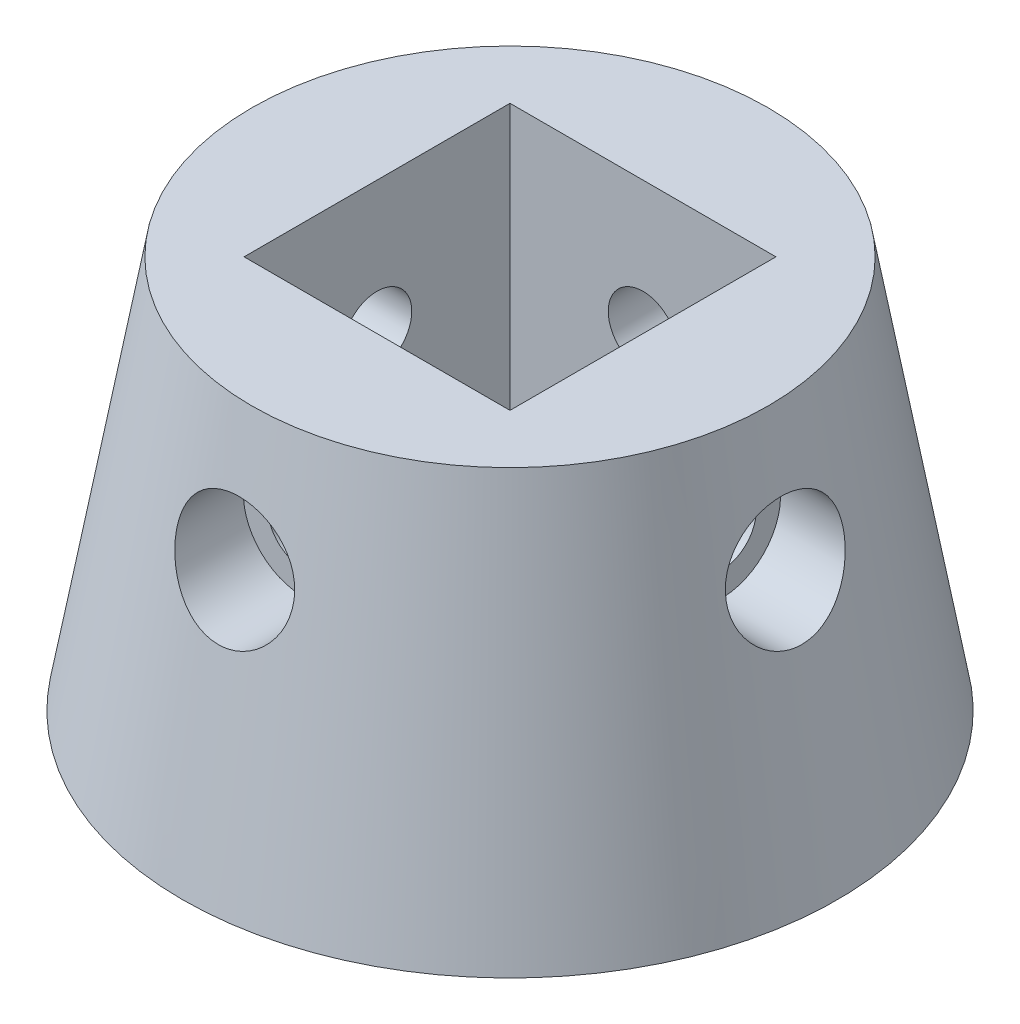
ISO-10303-21;
HEADER;
FILE_DESCRIPTION(('STEP AP214'),'2;1');
FILE_NAME('part.step','',(''),(''),'','','');
FILE_SCHEMA(('AUTOMOTIVE_DESIGN { 1 0 10303 214 1 1 1 1 }'));
ENDSEC;
DATA;
#1=APPLICATION_CONTEXT('core data for automotive mechanical design processes');
#2=APPLICATION_PROTOCOL_DEFINITION('international standard','automotive_design',2000,#1);
#3=PRODUCT_CONTEXT('',#1,'mechanical');
#4=PRODUCT('Part','Part','',(#3));
#5=PRODUCT_RELATED_PRODUCT_CATEGORY('part','',(#4));
#6=PRODUCT_DEFINITION_FORMATION('','',#4);
#7=PRODUCT_DEFINITION_CONTEXT('part definition',#1,'design');
#8=PRODUCT_DEFINITION('design','',#6,#7);
#9=PRODUCT_DEFINITION_SHAPE('','',#8);
#10=(LENGTH_UNIT() NAMED_UNIT(*) SI_UNIT(.MILLI.,.METRE.));
#11=(NAMED_UNIT(*) PLANE_ANGLE_UNIT() SI_UNIT($,.RADIAN.));
#12=(NAMED_UNIT(*) SI_UNIT($,.STERADIAN.) SOLID_ANGLE_UNIT());
#13=UNCERTAINTY_MEASURE_WITH_UNIT(LENGTH_MEASURE(1.E-05),#10,'distance_accuracy_value','');
#14=(GEOMETRIC_REPRESENTATION_CONTEXT(3) GLOBAL_UNCERTAINTY_ASSIGNED_CONTEXT((#13)) GLOBAL_UNIT_ASSIGNED_CONTEXT((#10,
#11,#12)) REPRESENTATION_CONTEXT('',''));
#15=CARTESIAN_POINT('',(0.,0.,0.));
#16=DIRECTION('',(0.,0.,1.));
#17=DIRECTION('',(1.,0.,0.));
#18=AXIS2_PLACEMENT_3D('',#15,#16,#17);
#19=CARTESIAN_POINT('',(0.,0.,0.));
#20=DIRECTION('',(0.,-1.,0.));
#21=DIRECTION('',(0.,0.,1.));
#22=AXIS2_PLACEMENT_3D('',#19,#20,#21);
#23=CONICAL_SURFACE('',#22,25.,0.174532925199433);
#24=CARTESIAN_POINT('',(-3.17924939476003,23.1847092937846,20.6688258492088));
#25=CARTESIAN_POINT('',(-3.00059448379588,23.3630397434884,20.6644896794293));
#26=CARTESIAN_POINT('',(-2.80677084879042,23.5264370171455,20.6628992762013));
#27=CARTESIAN_POINT('',(-2.3943624420111,23.8185076840616,20.6628964569913));
#28=CARTESIAN_POINT('',(-2.17575596313348,23.9471502971341,20.664486847649));
#29=CARTESIAN_POINT('',(-1.72017379836009,24.1659090108007,20.6686798525035));
#30=CARTESIAN_POINT('',(-1.48320722855043,24.2560440880279,20.6712819669091));
#31=CARTESIAN_POINT('',(-0.997562291741338,24.3953016215347,20.6758186026197));
#32=CARTESIAN_POINT('',(-0.748886203486125,24.4444320230146,20.677753253212));
#33=CARTESIAN_POINT('',(-0.246388998426274,24.5003668810089,20.6799842053389));
#34=CARTESIAN_POINT('',(0.00743997679781232,24.5071009123083,20.6802777807695));
#35=CARTESIAN_POINT('',(0.512629078209401,24.477860310658,20.6790822582704));
#36=CARTESIAN_POINT('',(0.763989119660604,24.4418842169821,20.6775930993695));
#37=CARTESIAN_POINT('',(1.25692288069639,24.3282876579257,20.6735562251311));
#38=CARTESIAN_POINT('',(1.49850319931375,24.2506957947592,20.6710092371028));
#39=CARTESIAN_POINT('',(1.96523370264023,24.0560801546741,20.6663400147529));
#40=CARTESIAN_POINT('',(2.19038348979655,23.9390554240233,20.6642177907067));
#41=CARTESIAN_POINT('',(2.61803215692439,23.6687786304909,20.6624439648929));
#42=CARTESIAN_POINT('',(2.82051384263947,23.5154993383775,20.6627942258329));
#43=CARTESIAN_POINT('',(3.19682888124425,23.1771523442005,20.6682995930261));
#44=CARTESIAN_POINT('',(3.37066375972014,22.9920863360117,20.6734544433136));
#45=CARTESIAN_POINT('',(3.68378537789302,22.596719390731,20.6907712707235));
#46=CARTESIAN_POINT('',(3.82326235522669,22.3865674335782,20.7028933650982));
#47=CARTESIAN_POINT('',(4.06499527422967,21.9464905597661,20.7358715893591));
#48=CARTESIAN_POINT('',(4.16725503902898,21.7165676770724,20.7567268216621));
#49=CARTESIAN_POINT('',(4.33107987681061,21.2462535529807,20.8078749161039));
#50=CARTESIAN_POINT('',(4.39303869442709,21.0059888287968,20.8380720750331));
#51=CARTESIAN_POINT('',(4.47666461546419,20.519908676123,20.9079268691845));
#52=CARTESIAN_POINT('',(4.49833015850463,20.2740930330436,20.9475848707161));
#53=CARTESIAN_POINT('',(4.50149813863872,19.7815456860653,21.0357275237627));
#54=CARTESIAN_POINT('',(4.48263819267845,19.5348255761311,21.0842882348035));
#55=CARTESIAN_POINT('',(4.40526520106138,19.0491330127787,21.1880672279834));
#56=CARTESIAN_POINT('',(4.34674439004499,18.810162086207,21.2432868121492));
#57=CARTESIAN_POINT('',(4.18932954593779,18.3375552494264,21.3598276566691));
#58=CARTESIAN_POINT('',(4.08908170859407,18.1044063958613,21.4212955918568));
#59=CARTESIAN_POINT('',(3.85106792700563,17.658374731201,21.5452567695456));
#60=CARTESIAN_POINT('',(3.71329326110753,17.4454966467998,21.6077502472173));
#61=CARTESIAN_POINT('',(3.39910258969567,17.0396255953365,21.7318677806788));
#62=CARTESIAN_POINT('',(3.22169391515468,16.8473756986293,21.7934158219225));
#63=CARTESIAN_POINT('',(2.834999979187,16.4955634579287,21.9096295618724));
#64=CARTESIAN_POINT('',(2.62571676719114,16.3359990139108,21.9642957026504));
#65=CARTESIAN_POINT('',(2.18491895047741,16.0575688415075,22.0618005211735));
#66=CARTESIAN_POINT('',(1.95390716437292,15.9379818614729,22.1048457564749));
#67=CARTESIAN_POINT('',(1.47287466478014,15.7399290760054,22.1770900763535));
#68=CARTESIAN_POINT('',(1.22286255171933,15.6614447910494,22.2062953827162));
#69=CARTESIAN_POINT('',(0.726631517957308,15.5522190646041,22.2471692677225));
#70=CARTESIAN_POINT('',(0.481041859030196,15.518959999244,22.2597613291924));
#71=CARTESIAN_POINT('',(-0.0125429709897271,15.4932422274715,22.269486182123));
#72=CARTESIAN_POINT('',(-0.260537492749591,15.5007727977558,22.2666230366477));
#73=CARTESIAN_POINT('',(-0.741543237699874,15.5551830330362,22.2460969119639));
#74=CARTESIAN_POINT('',(-0.974759486968966,15.6004976941979,22.2290226040751));
#75=CARTESIAN_POINT('',(-1.42997559376434,15.7267144499193,22.1820875386654));
#76=CARTESIAN_POINT('',(-1.65197476639247,15.8076187146072,22.1522260014273));
#77=CARTESIAN_POINT('',(-2.08293562555325,16.0039466443657,22.081135571466));
#78=CARTESIAN_POINT('',(-2.29160098656839,16.1199498995505,22.0397168047104));
#79=CARTESIAN_POINT('',(-2.68679452108829,16.3823452394143,21.9484309654771));
#80=CARTESIAN_POINT('',(-2.87331692185813,16.5287452213831,21.8985616981185));
#81=CARTESIAN_POINT('',(-3.23006835684602,16.8569622112505,21.7903742050016));
#82=CARTESIAN_POINT('',(-3.39879380711688,17.0403066377425,21.7317387502863));
#83=CARTESIAN_POINT('',(-3.70353074786168,17.4318560014476,21.6118462514121));
#84=CARTESIAN_POINT('',(-3.83953283380962,17.6400680598245,21.550588459551));
#85=CARTESIAN_POINT('',(-4.01914076827651,17.9718642575493,21.4580230978541));
#86=CARTESIAN_POINT('',(-4.07587322619095,18.0884355980823,21.4263687043237));
#87=CARTESIAN_POINT('',(-4.17912712884253,18.3261816951752,21.3637552831363));
#88=CARTESIAN_POINT('',(-4.22565215287156,18.4473548205538,21.3327960151592));
#89=CARTESIAN_POINT('',(-4.30814281769727,18.6935643116124,21.271997444554));
#90=CARTESIAN_POINT('',(-4.34410441261651,18.8186021372913,21.2421585748538));
#91=CARTESIAN_POINT('',(-4.40511309439848,19.0716127977618,21.1840259357653));
#92=CARTESIAN_POINT('',(-4.43016465094562,19.1995844079628,21.1557315377928));
#93=CARTESIAN_POINT('',(-4.46902265571744,19.4571116277664,21.1011430538228));
#94=CARTESIAN_POINT('',(-4.48287274768819,19.5866590738319,21.0748415697767));
#95=CARTESIAN_POINT('',(-4.49928042460086,19.8468390344228,21.0244316403668));
#96=CARTESIAN_POINT('',(-4.50184267254617,19.9774710785533,21.0003222934639));
#97=CARTESIAN_POINT('',(-4.49555519354621,20.2389351248404,20.9545192947697));
#98=CARTESIAN_POINT('',(-4.48670139216039,20.3697671817335,20.9328265084625));
#99=CARTESIAN_POINT('',(-4.45754020913605,20.630503872497,20.8920482318641));
#100=CARTESIAN_POINT('',(-4.43723778940656,20.7604088834724,20.8729616164891));
#101=CARTESIAN_POINT('',(-4.38621198285625,21.0135014682958,20.8381399070062));
#102=CARTESIAN_POINT('',(-4.35590364745784,21.1367593364967,20.8223066631473));
#103=CARTESIAN_POINT('',(-4.28489645736775,21.3804958255142,20.7931561879153));
#104=CARTESIAN_POINT('',(-4.24420183364132,21.5009755562961,20.7798379358681));
#105=CARTESIAN_POINT('',(-4.15268731207391,21.7381991358401,20.7556633996664));
#106=CARTESIAN_POINT('',(-4.10187375215137,21.8549452702555,20.7448055834922));
#107=CARTESIAN_POINT('',(-3.99047112305764,22.0838304807286,20.725424275998));
#108=CARTESIAN_POINT('',(-3.92988389007437,22.1959704172013,20.7169003470186));
#109=CARTESIAN_POINT('',(-3.76926117256739,22.4652067678558,20.6985811974112));
#110=CARTESIAN_POINT('',(-3.66389995735911,22.619253613318,20.6900049292877));
#111=CARTESIAN_POINT('',(-3.43486684897128,22.9131518154885,20.6767285067286));
#112=CARTESIAN_POINT('',(-3.3111950637094,23.0530032558525,20.6720283294492));
#113=CARTESIAN_POINT('',(-3.17924939476003,23.1847092937846,20.6688258492088));
#114=B_SPLINE_CURVE_WITH_KNOTS('',3,(#24,#25,#26,#27,#28,#29,#30,#31,#32,#33,#34,#35,#36,#37,
#38,#39,#40,#41,#42,#43,#44,#45,#46,#47,#48,#49,#50,#51,#52,#53,#54,#55,#56,#57,#58,#59,#60,#61,
#62,#63,#64,#65,#66,#67,#68,#69,#70,#71,#72,#73,#74,#75,#76,#77,#78,#79,#80,#81,#82,#83,#84,#85,
#86,#87,#88,#89,#90,#91,#92,#93,#94,#95,#96,#97,#98,#99,#100,#101,#102,#103,#104,#105,#106,#107,
#108,#109,#110,#111,#112,#113),.UNSPECIFIED.,.T.,.F.,(4,2,2,2,2,2,2,2,2,2,2,2,2,2,2,2,2,2,2,2,2,
2,2,2,2,2,2,2,2,2,2,2,2,2,2,2,2,2,2,2,2,2,2,2,4),(0.,0.756738749566194,1.5141455179145,
2.27117860209809,3.02806496699517,3.78620827562623,4.54437751421409,5.30202633512067,
6.05969348200831,6.817931497025,7.57612911900534,8.33002919670248,9.08385180830621,
9.83019423209084,10.5765655578121,11.3296387687871,12.0828594695956,12.8627011130308,
13.642724155237,14.4450614576684,15.2473471941385,16.0342601787758,16.8208190677095,
17.5615016891437,18.301989599867,19.0132474248028,19.7245486257421,20.448303827803,
21.1722473025318,21.9368526321257,22.7016774435729,23.101640338989,23.5014627602979,
23.9014381177001,24.3012494564976,24.6994954210836,25.097576855001,25.4958004053495,
25.8938514954096,26.2771185688669,26.6602297628989,27.0431017486475,27.4259018875173,
27.9847949425855,28.5436847038161),.UNSPECIFIED.);
#115=CARTESIAN_POINT('',(-3.17924939476003,23.1847092937846,20.6688258492088));
#116=VERTEX_POINT('',#115);
#117=EDGE_CURVE('E42',#116,#116,#114,.T.);
#118=ORIENTED_EDGE('',*,*,#117,.T.);
#119=EDGE_LOOP('',(#118));
#120=FACE_BOUND('',#119,.T.);
#121=CARTESIAN_POINT('',(-21.7914541380966,16.8554695092558,-3.21899800390633));
#122=CARTESIAN_POINT('',(-21.7314732233679,17.0414363123938,-3.40065170688877));
#123=CARTESIAN_POINT('',(-21.6687299975773,17.242829006405,-3.56583354097545));
#124=CARTESIAN_POINT('',(-21.5417670242332,17.6708631570974,-3.85908887190368));
#125=CARTESIAN_POINT('',(-21.4775455918032,17.8975346858128,-3.98711750467422));
#126=CARTESIAN_POINT('',(-21.3515302600539,18.3701046404572,-4.20247856633933));
#127=CARTESIAN_POINT('',(-21.2897361978848,18.616001773239,-4.28981372960122));
#128=CARTESIAN_POINT('',(-21.172051999836,19.1204421786408,-4.42088739269619));
#129=CARTESIAN_POINT('',(-21.1161595375898,19.3789804089912,-4.46464312900224));
#130=CARTESIAN_POINT('',(-21.0136788989299,19.8982487531926,-4.5062884362487));
#131=CARTESIAN_POINT('',(-20.9669844686622,20.1589125041839,-4.50473705032281));
#132=CARTESIAN_POINT('',(-20.8838152057966,20.6776567612038,-4.4562981510796));
#133=CARTESIAN_POINT('',(-20.8473383541507,20.9357377678633,-4.40941960281349));
#134=CARTESIAN_POINT('',(-20.7863708701644,21.4312512984631,-4.27375166985103));
#135=CARTESIAN_POINT('',(-20.7614721697674,21.6690963034378,-4.18664864476931));
#136=CARTESIAN_POINT('',(-20.7210516887864,22.1274369077757,-3.9733964273852));
#137=CARTESIAN_POINT('',(-20.7055290205559,22.3479341477646,-3.84725093301702));
#138=CARTESIAN_POINT('',(-20.6825533473325,22.7611078665356,-3.56204791799408));
#139=CARTESIAN_POINT('',(-20.6749611465849,22.9542109509866,-3.40361855840581));
#140=CARTESIAN_POINT('',(-20.665342460079,23.3116526104809,-3.05695059835511));
#141=CARTESIAN_POINT('',(-20.6633161696839,23.475990175666,-2.868710951798));
#142=CARTESIAN_POINT('',(-20.6625944924477,23.7723700429868,-2.46620024228235));
#143=CARTESIAN_POINT('',(-20.6639234485,23.9041686650699,-2.25174974040702));
#144=CARTESIAN_POINT('',(-20.6678120657937,24.1302332876188,-1.80391115061992));
#145=CARTESIAN_POINT('',(-20.6703717713716,24.2244979357406,-1.57052238072955));
#146=CARTESIAN_POINT('',(-20.6750244630621,24.3734677487436,-1.08936297331002));
#147=CARTESIAN_POINT('',(-20.6771135158778,24.4278475158394,-0.841491469968758));
#148=CARTESIAN_POINT('',(-20.6797244336443,24.4942468761369,-0.340130999631359));
#149=CARTESIAN_POINT('',(-20.6802462996013,24.5062664965338,-0.0866420362417292));
#150=CARTESIAN_POINT('',(-20.6794790638678,24.4876026366762,0.418783595373154));
#151=CARTESIAN_POINT('',(-20.6781897674226,24.4569145640553,0.670720093735433));
#152=CARTESIAN_POINT('',(-20.6744178171262,24.3537012350271,1.16586620727247));
#153=CARTESIAN_POINT('',(-20.6719351386962,24.2811751169233,1.40907564259502));
#154=CARTESIAN_POINT('',(-20.6671741203527,24.0963196005532,1.87993367059438));
#155=CARTESIAN_POINT('',(-20.6648958279075,23.9839809857208,2.10757864553986));
#156=CARTESIAN_POINT('',(-20.6625373996674,23.7226778197274,2.54079849668785));
#157=CARTESIAN_POINT('',(-20.6624572730465,23.5737131157079,2.74637328077563));
#158=CARTESIAN_POINT('',(-20.6668041228617,23.2435590821196,3.12940750490307));
#159=CARTESIAN_POINT('',(-20.6712269928845,23.0623992364827,3.30689239054253));
#160=CARTESIAN_POINT('',(-20.6868486973955,22.6730593548041,3.62884944073173));
#161=CARTESIAN_POINT('',(-20.6980468887992,22.4648818846322,3.77332473661742));
#162=CARTESIAN_POINT('',(-20.7289305078435,22.0298091802031,4.02396696108423));
#163=CARTESIAN_POINT('',(-20.7485351785988,21.803108254685,4.13048117088881));
#164=CARTESIAN_POINT('',(-20.7972739113989,21.3361232231018,4.30428176170681));
#165=CARTESIAN_POINT('',(-20.826407409374,21.0958399217567,4.37157046406207));
#166=CARTESIAN_POINT('',(-20.8941301115922,20.6099554787524,4.46529907740965));
#167=CARTESIAN_POINT('',(-20.9326742004083,20.3643846622018,4.49192961551499));
#168=CARTESIAN_POINT('',(-21.0183755043157,19.8736994118919,4.50492072120693));
#169=CARTESIAN_POINT('',(-21.0655337303586,19.6285850351146,4.49127655931892));
#170=CARTESIAN_POINT('',(-21.1677957957354,19.1398673881947,4.42406526256084));
#171=CARTESIAN_POINT('',(-21.223051975279,18.8964167558043,4.3696240048721));
#172=CARTESIAN_POINT('',(-21.3380884873053,18.422747000348,4.22183204463767));
#173=CARTESIAN_POINT('',(-21.3978698743275,18.1925309835616,4.12847224965662));
#174=CARTESIAN_POINT('',(-21.5211786051246,17.7423522111069,3.901155034538));
#175=CARTESIAN_POINT('',(-21.5847617464411,17.5231191826338,3.76578048279493));
#176=CARTESIAN_POINT('',(-21.7096775204643,17.1104593542585,3.45928150198154));
#177=CARTESIAN_POINT('',(-21.7710097975856,16.9170366191795,3.28815145269625));
#178=CARTESIAN_POINT('',(-21.8881103796041,16.5594432406311,2.91214632274217));
#179=CARTESIAN_POINT('',(-21.9438105449227,16.395615421545,2.70692286026827));
#180=CARTESIAN_POINT('',(-22.0448376076616,16.1052414899689,2.26930592955076));
#181=CARTESIAN_POINT('',(-22.0901673737946,15.9786850644857,2.03692000206747));
#182=CARTESIAN_POINT('',(-22.1652589537469,15.7720438349296,1.5616417069832));
#183=CARTESIAN_POINT('',(-22.1955877952127,15.6902513852438,1.31958312957959));
#184=CARTESIAN_POINT('',(-22.2409540345823,15.5686978968952,0.823786277098663));
#185=CARTESIAN_POINT('',(-22.2559984265627,15.5289176333667,0.570053399725702));
#186=CARTESIAN_POINT('',(-22.2691455311167,15.4941384538093,0.0739129233270785));
#187=CARTESIAN_POINT('',(-22.2681778053222,15.4966825067582,-0.168300892509257));
#188=CARTESIAN_POINT('',(-22.2516372323895,15.5404780987745,-0.648711951444363));
#189=CARTESIAN_POINT('',(-22.2360635730244,15.5817317904611,-0.886908970421638));
#190=CARTESIAN_POINT('',(-22.1918397221043,15.700376531525,-1.34879610671088));
#191=CARTESIAN_POINT('',(-22.1633963469706,15.7771964683369,-1.5726540580969));
#192=CARTESIAN_POINT('',(-22.0954751490613,15.9640526649531,-2.00408106791978));
#193=CARTESIAN_POINT('',(-22.0560038908053,16.0740691670909,-2.21165972300559));
#194=CARTESIAN_POINT('',(-21.9794929499039,16.2926428069479,-2.55659754876228));
#195=CARTESIAN_POINT('',(-21.9443071114553,16.394704895435,-2.69854803082083));
#196=CARTESIAN_POINT('',(-21.8703094639433,16.6140419697911,-2.9691128277408));
#197=CARTESIAN_POINT('',(-21.8314973669812,16.7313181638373,-3.09772608200978));
#198=CARTESIAN_POINT('',(-21.7914541380966,16.8554695092558,-3.21899800390633));
#199=B_SPLINE_CURVE_WITH_KNOTS('',3,(#121,#122,#123,#124,#125,#126,#127,#128,#129,#130,#131,
#132,#133,#134,#135,#136,#137,#138,#139,#140,#141,#142,#143,#144,#145,#146,#147,#148,#149,#150,
#151,#152,#153,#154,#155,#156,#157,#158,#159,#160,#161,#162,#163,#164,#165,#166,#167,#168,#169,
#170,#171,#172,#173,#174,#175,#176,#177,#178,#179,#180,#181,#182,#183,#184,#185,#186,#187,#188,
#189,#190,#191,#192,#193,#194,#195,#196,#197,#198),.UNSPECIFIED.,.T.,.F.,(4,2,2,2,2,2,2,2,2,2,2,
2,2,2,2,2,2,2,2,2,2,2,2,2,2,2,2,2,2,2,2,2,2,2,2,2,2,2,4),(0.,0.799735222650336,1.60043217896686,
2.40107532528733,3.20140167646408,3.99185704718099,4.78215610933479,5.54197125324817,
6.30171445276205,7.04788631518533,7.7940843678778,8.5457117502673,9.29736621123999,
10.0550867758402,10.8128068539846,11.5706084162093,12.3284255866739,13.0864183060217,
13.8444141888936,14.601719451931,15.3589528460751,16.1090693439412,16.8591414458586,
17.6056858924167,18.3523180094842,19.1154220060165,19.8787043845302,20.6712020196211,
21.4638243170066,22.2651097818397,23.066173322255,23.83405873996,24.6015926192099,
25.3247330765109,26.0479137495924,26.7598643970617,27.4713921444391,28.005252561187,
28.5391553986565),.UNSPECIFIED.);
#200=CARTESIAN_POINT('',(-21.7914541380966,16.8554695092558,-3.21899800390633));
#201=VERTEX_POINT('',#200);
#202=EDGE_CURVE('E214',#201,#201,#199,.T.);
#203=ORIENTED_EDGE('',*,*,#202,.T.);
#204=EDGE_LOOP('',(#203));
#205=FACE_BOUND('',#204,.T.);
#206=CARTESIAN_POINT('',(-3.20127830898228,16.8374324125222,-21.7972792613538));
#207=CARTESIAN_POINT('',(-3.38400454210941,17.0224066165993,-21.7374766748652));
#208=CARTESIAN_POINT('',(-3.55033171913201,17.2228952149717,-21.6748453104863));
#209=CARTESIAN_POINT('',(-3.8459976090057,17.6493067466495,-21.5479773639461));
#210=CARTESIAN_POINT('',(-3.97529123964005,17.8752602171153,-21.4837389279567));
#211=CARTESIAN_POINT('',(-4.19327890193763,18.3465839032923,-21.357572495071));
#212=CARTESIAN_POINT('',(-4.28197719316229,18.5919520786997,-21.2956442563984));
#213=CARTESIAN_POINT('',(-4.41586062608735,19.0955563441571,-21.177588476712));
#214=CARTESIAN_POINT('',(-4.4610628963888,19.353787326703,-21.1214586600766));
#215=CARTESIAN_POINT('',(-4.50564864690899,19.8728473324539,-21.0183990935851));
#216=CARTESIAN_POINT('',(-4.5055641878516,20.1336101900884,-20.9713690045738));
#217=CARTESIAN_POINT('',(-4.46001105897632,20.652812412696,-20.887501102933));
#218=CARTESIAN_POINT('',(-4.41455139548557,20.9112522284882,-20.8506612695372));
#219=CARTESIAN_POINT('',(-4.2815686855852,21.4077122690519,-20.7889959927831));
#220=CARTESIAN_POINT('',(-4.19573665784073,21.6461356213252,-20.7637617564913));
#221=CARTESIAN_POINT('',(-3.98489018435501,22.1058431196051,-20.7227156124485));
#222=CARTESIAN_POINT('',(-3.8598795685622,22.3271289382755,-20.7069027841349));
#223=CARTESIAN_POINT('',(-3.57682899524289,22.7419327774717,-20.683425839585));
#224=CARTESIAN_POINT('',(-3.41943801361548,22.9358862395261,-20.6756173593691));
#225=CARTESIAN_POINT('',(-3.0746876530252,23.295191662898,-20.6656370354382));
#226=CARTESIAN_POINT('',(-2.88732725127564,23.4605426476784,-20.6634653841386));
#227=CARTESIAN_POINT('',(-2.48644333560961,23.7590551801163,-20.6625244885863));
#228=CARTESIAN_POINT('',(-2.27274454044582,23.8919813631341,-20.6637793601978));
#229=CARTESIAN_POINT('',(-1.82621438580077,24.1204175111936,-20.6675834218009));
#230=CARTESIAN_POINT('',(-1.59338232364833,24.2159261013268,-20.6701326593461));
#231=CARTESIAN_POINT('',(-1.11309595853507,24.3674869405223,-20.6748112517865));
#232=CARTESIAN_POINT('',(-0.865537396280813,24.4232091779483,-20.6769369916971));
#233=CARTESIAN_POINT('',(-0.364573057645723,24.4923294076415,-20.6796436168212));
#234=CARTESIAN_POINT('',(-0.111167284431968,24.5057274228326,-20.6802245028715));
#235=CARTESIAN_POINT('',(0.394343387607957,24.4898165460665,-20.6795697682601));
#236=CARTESIAN_POINT('',(0.646448044963439,24.4604999939579,-20.678333821779));
#237=CARTESIAN_POINT('',(1.14215779309398,24.3599812375938,-20.674635653879));
#238=CARTESIAN_POINT('',(1.38576271237185,24.2887781887216,-20.6721734077326));
#239=CARTESIAN_POINT('',(1.85761828043178,24.1064871279954,-20.667397714448));
#240=CARTESIAN_POINT('',(2.08586594954936,23.9953914023776,-20.6650842961896));
#241=CARTESIAN_POINT('',(2.52049219584248,23.7364560247484,-20.662584530639));
#242=CARTESIAN_POINT('',(2.72687065599912,23.5886161761387,-20.6623981947279));
#243=CARTESIAN_POINT('',(3.11171070458954,23.2605420016638,-20.6664565878537));
#244=CARTESIAN_POINT('',(3.29019481260757,23.0803340623978,-20.6706977210515));
#245=CARTESIAN_POINT('',(3.61429607441826,22.6927072152465,-20.685888064491));
#246=CARTESIAN_POINT('',(3.75991630556402,22.4852908580192,-20.6968366462943));
#247=CARTESIAN_POINT('',(4.01295921181861,22.0514934281567,-20.7271771770563));
#248=CARTESIAN_POINT('',(4.12072428994636,21.8253065127715,-20.7464897141247));
#249=CARTESIAN_POINT('',(4.29708080033008,21.3591176835926,-20.7946279838659));
#250=CARTESIAN_POINT('',(4.36567464193616,21.1191166204813,-20.8234531312636));
#251=CARTESIAN_POINT('',(4.46200142395355,20.6336345548825,-20.8905677094128));
#252=CARTESIAN_POINT('',(4.4899365661034,20.3881868760547,-20.928809192283));
#253=CARTESIAN_POINT('',(4.50552700050481,19.8975319180976,-21.0139476475449));
#254=CARTESIAN_POINT('',(4.49317766950898,19.6523246697918,-21.060845612815));
#255=CARTESIAN_POINT('',(4.42855766691557,19.1633330634502,-21.1626264386761));
#256=CARTESIAN_POINT('',(4.37543084757964,18.9196937243253,-21.2176598330555));
#257=CARTESIAN_POINT('',(4.23023639016859,18.4454454804704,-21.3323386493527));
#258=CARTESIAN_POINT('',(4.13815969018511,18.2148396222153,-21.3919851418931));
#259=CARTESIAN_POINT('',(3.91340059721051,17.7636599066677,-21.5151291894321));
#260=CARTESIAN_POINT('',(3.77929736216678,17.5438091349859,-21.5786867300527));
#261=CARTESIAN_POINT('',(3.4752598787238,17.1297099214117,-21.7036791677399));
#262=CARTESIAN_POINT('',(3.305319841451,16.935465624092,-21.7651137200027));
#263=CARTESIAN_POINT('',(2.93144985271425,16.5758740801111,-21.8826021657056));
#264=CARTESIAN_POINT('',(2.72714526998676,16.4108917556851,-21.9385846474143));
#265=CARTESIAN_POINT('',(2.29116469147584,16.1180597797728,-22.0402966892438));
#266=CARTESIAN_POINT('',(2.05949609002747,15.990200129104,-22.0860290095399));
#267=CARTESIAN_POINT('',(1.58520722331522,15.7808112489398,-22.1620326662092));
#268=CARTESIAN_POINT('',(1.34341637136738,15.6976082612717,-22.1928574795202));
#269=CARTESIAN_POINT('',(0.847880690323184,15.5732327154256,-22.2392473062485));
#270=CARTESIAN_POINT('',(0.594141420709964,15.5320408081563,-22.2548193445229));
#271=CARTESIAN_POINT('',(0.0977858112104745,15.4945844829569,-22.2689757209444));
#272=CARTESIAN_POINT('',(-0.144620474460385,15.4958493250809,-22.2684942905174));
#273=CARTESIAN_POINT('',(-0.625640282041788,15.537172456742,-22.2528840655152));
#274=CARTESIAN_POINT('',(-0.864253611370286,15.5772327097076,-22.2377545296022));
#275=CARTESIAN_POINT('',(-1.3269314625682,15.6935793468711,-22.1943610180861));
#276=CARTESIAN_POINT('',(-1.55117093331455,15.7692579027526,-22.1663175859147));
#277=CARTESIAN_POINT('',(-1.98353629097331,15.9539163240397,-22.0991275076519));
#278=CARTESIAN_POINT('',(-2.19167176526676,16.062876181506,-22.0599875335543));
#279=CARTESIAN_POINT('',(-2.53737653951536,16.2794798557016,-21.9840571216223));
#280=CARTESIAN_POINT('',(-2.67953178683069,16.3805683325467,-21.9491496413914));
#281=CARTESIAN_POINT('',(-2.95064222797571,16.5979545746359,-21.8756728632032));
#282=CARTESIAN_POINT('',(-3.07959639603861,16.7142535201862,-21.8371032811368));
#283=CARTESIAN_POINT('',(-3.20127830898228,16.8374324125222,-21.7972792613538));
#284=B_SPLINE_CURVE_WITH_KNOTS('',3,(#206,#207,#208,#209,#210,#211,#212,#213,#214,#215,#216,
#217,#218,#219,#220,#221,#222,#223,#224,#225,#226,#227,#228,#229,#230,#231,#232,#233,#234,#235,
#236,#237,#238,#239,#240,#241,#242,#243,#244,#245,#246,#247,#248,#249,#250,#251,#252,#253,#254,
#255,#256,#257,#258,#259,#260,#261,#262,#263,#264,#265,#266,#267,#268,#269,#270,#271,#272,#273,
#274,#275,#276,#277,#278,#279,#280,#281,#282,#283),.UNSPECIFIED.,.T.,.F.,(4,2,2,2,2,2,2,2,2,2,2,
2,2,2,2,2,2,2,2,2,2,2,2,2,2,2,2,2,2,2,2,2,2,2,2,2,2,2,4),(0.,0.799743152181503,1.6004557614503,
2.40108433479345,3.20139749384824,3.99230821284725,4.78306197862564,5.54329891288108,
6.30346155245962,7.0496591719698,7.79588226290686,8.54737078220547,9.29888691234167,
10.0565663475187,10.8142453723166,11.5720602910456,12.3298904911941,13.0878673065682,
13.8458481775597,14.6032139209751,15.3605087156781,16.1107657805496,16.8609766935287,
17.6074437957095,18.3539965691979,19.1166674618906,19.8795158919227,20.6715975693553,
21.4638072933086,22.2652914765369,23.0665595751852,23.8352181084139,24.6035224596094,
25.3271978859011,26.050909939184,26.7626963416916,27.4740556742919,28.0065830494642,
28.5391517723872),.UNSPECIFIED.);
#285=CARTESIAN_POINT('',(-3.20127830898228,16.8374324125222,-21.7972792613538));
#286=VERTEX_POINT('',#285);
#287=EDGE_CURVE('E149',#286,#286,#284,.T.);
#288=ORIENTED_EDGE('',*,*,#287,.F.);
#289=EDGE_LOOP('',(#288));
#290=FACE_BOUND('',#289,.T.);
#291=CARTESIAN_POINT('',(0.,30.,0.));
#292=DIRECTION('',(0.,1.,0.));
#293=DIRECTION('',(0.,0.,1.));
#294=AXIS2_PLACEMENT_3D('',#291,#292,#293);
#295=CIRCLE('',#294,19.7101905787461);
#296=CARTESIAN_POINT('',(0.,30.,19.7101905787461));
#297=VERTEX_POINT('',#296);
#298=EDGE_CURVE('E11',#297,#297,#295,.T.);
#299=ORIENTED_EDGE('',*,*,#298,.F.);
#300=EDGE_LOOP('',(#299));
#301=FACE_BOUND('',#300,.T.);
#302=CARTESIAN_POINT('',(0.,0.,0.));
#303=DIRECTION('',(0.,1.,0.));
#304=DIRECTION('',(0.,0.,1.));
#305=AXIS2_PLACEMENT_3D('',#302,#303,#304);
#306=CIRCLE('',#305,25.);
#307=CARTESIAN_POINT('',(0.,0.,25.));
#308=VERTEX_POINT('',#307);
#309=EDGE_CURVE('E52',#308,#308,#306,.T.);
#310=ORIENTED_EDGE('',*,*,#309,.T.);
#311=EDGE_LOOP('',(#310));
#312=FACE_BOUND('',#311,.T.);
#313=CARTESIAN_POINT('',(21.7972792613538,16.8374324125222,-3.20127830898228));
#314=CARTESIAN_POINT('',(21.7374766748652,17.0224066165993,-3.38400454210941));
#315=CARTESIAN_POINT('',(21.6748453104863,17.2228952149717,-3.55033171913201));
#316=CARTESIAN_POINT('',(21.5479773639461,17.6493067466495,-3.8459976090057));
#317=CARTESIAN_POINT('',(21.4837389279567,17.8752602171153,-3.97529123964005));
#318=CARTESIAN_POINT('',(21.357572495071,18.3465839032923,-4.19327890193763));
#319=CARTESIAN_POINT('',(21.2956442563984,18.5919520786997,-4.28197719316229));
#320=CARTESIAN_POINT('',(21.177588476712,19.0955563441571,-4.41586062608735));
#321=CARTESIAN_POINT('',(21.1214586600766,19.353787326703,-4.4610628963888));
#322=CARTESIAN_POINT('',(21.0183990935851,19.8728473324539,-4.50564864690899));
#323=CARTESIAN_POINT('',(20.9713690045738,20.1336101900884,-4.5055641878516));
#324=CARTESIAN_POINT('',(20.887501102933,20.652812412696,-4.46001105897632));
#325=CARTESIAN_POINT('',(20.8506612695372,20.9112522284882,-4.41455139548557));
#326=CARTESIAN_POINT('',(20.7889959927831,21.4077122690519,-4.2815686855852));
#327=CARTESIAN_POINT('',(20.7637617564913,21.6461356213252,-4.19573665784073));
#328=CARTESIAN_POINT('',(20.7227156124485,22.1058431196051,-3.98489018435501));
#329=CARTESIAN_POINT('',(20.7069027841349,22.3271289382755,-3.8598795685622));
#330=CARTESIAN_POINT('',(20.683425839585,22.7419327774717,-3.57682899524289));
#331=CARTESIAN_POINT('',(20.6756173593691,22.9358862395261,-3.41943801361547));
#332=CARTESIAN_POINT('',(20.6656370354382,23.295191662898,-3.07468765302519));
#333=CARTESIAN_POINT('',(20.6634653841386,23.4605426476784,-2.88732725127564));
#334=CARTESIAN_POINT('',(20.6625244885863,23.7590551801163,-2.48644333560961));
#335=CARTESIAN_POINT('',(20.6637793601978,23.8919813631341,-2.27274454044581));
#336=CARTESIAN_POINT('',(20.6675834218009,24.1204175111937,-1.82621438580077));
#337=CARTESIAN_POINT('',(20.6701326593461,24.2159261013269,-1.59338232364832));
#338=CARTESIAN_POINT('',(20.6748112517865,24.3674869405223,-1.11309595853507));
#339=CARTESIAN_POINT('',(20.6769369916971,24.4232091779483,-0.865537396280808));
#340=CARTESIAN_POINT('',(20.6796436168212,24.4923294076415,-0.364573057645719));
#341=CARTESIAN_POINT('',(20.6802245028715,24.5057274228326,-0.111167284431965));
#342=CARTESIAN_POINT('',(20.6795697682601,24.4898165460665,0.39434338760796));
#343=CARTESIAN_POINT('',(20.678333821779,24.4604999939579,0.646448044963441));
#344=CARTESIAN_POINT('',(20.674635653879,24.3599812375938,1.14215779309398));
#345=CARTESIAN_POINT('',(20.6721734077326,24.2887781887216,1.38576271237185));
#346=CARTESIAN_POINT('',(20.667397714448,24.1064871279954,1.85761828043179));
#347=CARTESIAN_POINT('',(20.6650842961896,23.9953914023776,2.08586594954936));
#348=CARTESIAN_POINT('',(20.662584530639,23.7364560247484,2.52049219584248));
#349=CARTESIAN_POINT('',(20.6623981947279,23.5886161761387,2.72687065599912));
#350=CARTESIAN_POINT('',(20.6664565878537,23.2605420016638,3.11171070458954));
#351=CARTESIAN_POINT('',(20.6706977210515,23.0803340623978,3.29019481260757));
#352=CARTESIAN_POINT('',(20.685888064491,22.6927072152465,3.61429607441826));
#353=CARTESIAN_POINT('',(20.6968366462943,22.4852908580192,3.75991630556402));
#354=CARTESIAN_POINT('',(20.7271771770563,22.0514934281567,4.01295921181861));
#355=CARTESIAN_POINT('',(20.7464897141247,21.8253065127715,4.12072428994636));
#356=CARTESIAN_POINT('',(20.7946279838659,21.3591176835926,4.29708080033009));
#357=CARTESIAN_POINT('',(20.8234531312636,21.1191166204813,4.36567464193617));
#358=CARTESIAN_POINT('',(20.8905677094128,20.6336345548825,4.46200142395355));
#359=CARTESIAN_POINT('',(20.928809192283,20.3881868760547,4.4899365661034));
#360=CARTESIAN_POINT('',(21.0139476475449,19.8975319180976,4.50552700050481));
#361=CARTESIAN_POINT('',(21.060845612815,19.6523246697918,4.49317766950898));
#362=CARTESIAN_POINT('',(21.1626264386761,19.1633330634502,4.42855766691557));
#363=CARTESIAN_POINT('',(21.2176598330555,18.9196937243253,4.37543084757964));
#364=CARTESIAN_POINT('',(21.3323386493527,18.4454454804704,4.23023639016859));
#365=CARTESIAN_POINT('',(21.3919851418931,18.2148396222153,4.13815969018511));
#366=CARTESIAN_POINT('',(21.5151291894321,17.7636599066677,3.91340059721051));
#367=CARTESIAN_POINT('',(21.5786867300527,17.5438091349859,3.77929736216677));
#368=CARTESIAN_POINT('',(21.7036791677399,17.1297099214117,3.4752598787238));
#369=CARTESIAN_POINT('',(21.7651137200027,16.935465624092,3.30531984145099));
#370=CARTESIAN_POINT('',(21.8826021657056,16.5758740801111,2.93144985271425));
#371=CARTESIAN_POINT('',(21.9385846474143,16.4108917556851,2.72714526998675));
#372=CARTESIAN_POINT('',(22.0402966892438,16.1180597797728,2.29116469147584));
#373=CARTESIAN_POINT('',(22.0860290095399,15.990200129104,2.05949609002747));
#374=CARTESIAN_POINT('',(22.1620326662092,15.7808112489398,1.58520722331522));
#375=CARTESIAN_POINT('',(22.1928574795202,15.6976082612717,1.34341637136738));
#376=CARTESIAN_POINT('',(22.2392473062485,15.5732327154256,0.847880690323182));
#377=CARTESIAN_POINT('',(22.2548193445229,15.5320408081563,0.594141420709963));
#378=CARTESIAN_POINT('',(22.2689757209444,15.4945844829569,0.0977858112104741));
#379=CARTESIAN_POINT('',(22.2684942905174,15.4958493250809,-0.144620474460385));
#380=CARTESIAN_POINT('',(22.2528840655152,15.537172456742,-0.625640282041787));
#381=CARTESIAN_POINT('',(22.2377545296022,15.5772327097076,-0.864253611370285));
#382=CARTESIAN_POINT('',(22.1943610180861,15.6935793468711,-1.3269314625682));
#383=CARTESIAN_POINT('',(22.1663175859147,15.7692579027526,-1.55117093331455));
#384=CARTESIAN_POINT('',(22.0991275076519,15.9539163240397,-1.98353629097331));
#385=CARTESIAN_POINT('',(22.0599875335543,16.062876181506,-2.19167176526676));
#386=CARTESIAN_POINT('',(21.9840571216223,16.2794798557016,-2.53737653951536));
#387=CARTESIAN_POINT('',(21.9491496413914,16.3805683325467,-2.67953178683069));
#388=CARTESIAN_POINT('',(21.8756728632032,16.5979545746359,-2.95064222797571));
#389=CARTESIAN_POINT('',(21.8371032811368,16.7142535201862,-3.07959639603861));
#390=CARTESIAN_POINT('',(21.7972792613538,16.8374324125222,-3.20127830898228));
#391=B_SPLINE_CURVE_WITH_KNOTS('',3,(#313,#314,#315,#316,#317,#318,#319,#320,#321,#322,#323,
#324,#325,#326,#327,#328,#329,#330,#331,#332,#333,#334,#335,#336,#337,#338,#339,#340,#341,#342,
#343,#344,#345,#346,#347,#348,#349,#350,#351,#352,#353,#354,#355,#356,#357,#358,#359,#360,#361,
#362,#363,#364,#365,#366,#367,#368,#369,#370,#371,#372,#373,#374,#375,#376,#377,#378,#379,#380,
#381,#382,#383,#384,#385,#386,#387,#388,#389,#390),.UNSPECIFIED.,.T.,.F.,(4,2,2,2,2,2,2,2,2,2,2,
2,2,2,2,2,2,2,2,2,2,2,2,2,2,2,2,2,2,2,2,2,2,2,2,2,2,2,4),(0.,0.799743152181503,1.6004557614503,
2.40108433479345,3.20139749384824,3.99230821284725,4.78306197862564,5.54329891288109,
6.30346155245963,7.0496591719698,7.79588226290687,8.54737078220548,9.29888691234168,
10.0565663475187,10.8142453723166,11.5720602910456,12.3298904911941,13.0878673065682,
13.8458481775597,14.6032139209752,15.3605087156781,16.1107657805496,16.8609766935287,
17.6074437957095,18.3539965691979,19.1166674618906,19.8795158919227,20.6715975693553,
21.4638072933086,22.2652914765369,23.0665595751852,23.8352181084139,24.6035224596095,
25.3271978859011,26.050909939184,26.7626963416916,27.474055674292,28.0065830494642,
28.5391517723872),.UNSPECIFIED.);
#392=CARTESIAN_POINT('',(21.7972792613538,16.8374324125222,-3.20127830898228));
#393=VERTEX_POINT('',#392);
#394=EDGE_CURVE('E223',#393,#393,#391,.T.);
#395=ORIENTED_EDGE('',*,*,#394,.F.);
#396=EDGE_LOOP('',(#395));
#397=FACE_BOUND('',#396,.T.);
#398=ADVANCED_FACE('F38',(#120,#205,#290,#301,#312,#397),#23,.T.);
#399=CARTESIAN_POINT('',(0.,30.,0.));
#400=DIRECTION('',(0.,1.,0.));
#401=DIRECTION('',(0.,0.,1.));
#402=AXIS2_PLACEMENT_3D('',#399,#400,#401);
#403=PLANE('',#402);
#404=DIRECTION('',(0.,0.,-1.));
#405=VECTOR('',#404,1.);
#406=CARTESIAN_POINT('',(10.15,30.,-10.15));
#407=LINE('',#406,#405);
#408=CARTESIAN_POINT('',(10.15,30.,10.15));
#409=VERTEX_POINT('',#408);
#410=CARTESIAN_POINT('',(10.15,30.,-10.15));
#411=VERTEX_POINT('',#410);
#412=EDGE_CURVE('E60',#409,#411,#407,.T.);
#413=ORIENTED_EDGE('',*,*,#412,.F.);
#414=DIRECTION('',(1.,0.,0.));
#415=VECTOR('',#414,1.);
#416=CARTESIAN_POINT('',(-10.15,30.,10.15));
#417=LINE('',#416,#415);
#418=CARTESIAN_POINT('',(-10.15,30.,10.15));
#419=VERTEX_POINT('',#418);
#420=EDGE_CURVE('E107',#419,#409,#417,.T.);
#421=ORIENTED_EDGE('',*,*,#420,.F.);
#422=DIRECTION('',(0.,0.,1.));
#423=VECTOR('',#422,1.);
#424=CARTESIAN_POINT('',(-10.15,30.,-10.15));
#425=LINE('',#424,#423);
#426=CARTESIAN_POINT('',(-10.15,30.,-10.15));
#427=VERTEX_POINT('',#426);
#428=EDGE_CURVE('E111',#427,#419,#425,.T.);
#429=ORIENTED_EDGE('',*,*,#428,.F.);
#430=DIRECTION('',(-1.,0.,0.));
#431=VECTOR('',#430,1.);
#432=CARTESIAN_POINT('',(-10.15,30.,-10.15));
#433=LINE('',#432,#431);
#434=EDGE_CURVE('E123',#411,#427,#433,.T.);
#435=ORIENTED_EDGE('',*,*,#434,.F.);
#436=EDGE_LOOP('',(#413,#421,#429,#435));
#437=FACE_BOUND('',#436,.T.);
#438=ORIENTED_EDGE('',*,*,#298,.T.);
#439=EDGE_LOOP('',(#438));
#440=FACE_BOUND('',#439,.T.);
#441=ADVANCED_FACE('F196',(#437,#440),#403,.T.);
#442=CARTESIAN_POINT('',(0.,0.,0.));
#443=DIRECTION('',(0.,1.,0.));
#444=DIRECTION('',(0.,0.,1.));
#445=AXIS2_PLACEMENT_3D('',#442,#443,#444);
#446=PLANE('',#445);
#447=DIRECTION('',(1.,0.,0.));
#448=VECTOR('',#447,1.);
#449=CARTESIAN_POINT('',(-10.15,0.,10.15));
#450=LINE('',#449,#448);
#451=CARTESIAN_POINT('',(-10.15,0.,10.15));
#452=VERTEX_POINT('',#451);
#453=CARTESIAN_POINT('',(10.15,0.,10.15));
#454=VERTEX_POINT('',#453);
#455=EDGE_CURVE('E95',#452,#454,#450,.T.);
#456=ORIENTED_EDGE('',*,*,#455,.T.);
#457=DIRECTION('',(0.,0.,-1.));
#458=VECTOR('',#457,1.);
#459=CARTESIAN_POINT('',(10.15,0.,-10.15));
#460=LINE('',#459,#458);
#461=CARTESIAN_POINT('',(10.15,0.,-10.15));
#462=VERTEX_POINT('',#461);
#463=EDGE_CURVE('E88',#454,#462,#460,.T.);
#464=ORIENTED_EDGE('',*,*,#463,.T.);
#465=DIRECTION('',(-1.,0.,0.));
#466=VECTOR('',#465,1.);
#467=CARTESIAN_POINT('',(-10.15,0.,-10.15));
#468=LINE('',#467,#466);
#469=CARTESIAN_POINT('',(-10.15,0.,-10.15));
#470=VERTEX_POINT('',#469);
#471=EDGE_CURVE('E98',#462,#470,#468,.T.);
#472=ORIENTED_EDGE('',*,*,#471,.T.);
#473=DIRECTION('',(0.,0.,1.));
#474=VECTOR('',#473,1.);
#475=CARTESIAN_POINT('',(-10.15,0.,-10.15));
#476=LINE('',#475,#474);
#477=EDGE_CURVE('E68',#470,#452,#476,.T.);
#478=ORIENTED_EDGE('',*,*,#477,.T.);
#479=EDGE_LOOP('',(#456,#464,#472,#478));
#480=FACE_BOUND('',#479,.T.);
#481=ORIENTED_EDGE('',*,*,#309,.F.);
#482=EDGE_LOOP('',(#481));
#483=FACE_BOUND('',#482,.T.);
#484=ADVANCED_FACE('F103',(#480,#483),#446,.F.);
#485=CARTESIAN_POINT('',(10.15,0.,-10.15));
#486=DIRECTION('',(1.,0.,0.));
#487=DIRECTION('',(0.,0.,-1.));
#488=AXIS2_PLACEMENT_3D('',#485,#486,#487);
#489=PLANE('',#488);
#490=CARTESIAN_POINT('',(10.15,20.,0.));
#491=DIRECTION('',(1.,0.,0.));
#492=DIRECTION('',(0.,0.,-1.));
#493=AXIS2_PLACEMENT_3D('',#490,#491,#492);
#494=CIRCLE('',#493,2.65);
#495=CARTESIAN_POINT('',(10.15,20.,-2.65));
#496=VERTEX_POINT('',#495);
#497=EDGE_CURVE('E114',#496,#496,#494,.T.);
#498=ORIENTED_EDGE('',*,*,#497,.T.);
#499=EDGE_LOOP('',(#498));
#500=FACE_BOUND('',#499,.T.);
#501=ORIENTED_EDGE('',*,*,#412,.T.);
#502=DIRECTION('',(0.,1.,0.));
#503=VECTOR('',#502,1.);
#504=CARTESIAN_POINT('',(10.15,0.,-10.15));
#505=LINE('',#504,#503);
#506=EDGE_CURVE('E84',#462,#411,#505,.T.);
#507=ORIENTED_EDGE('',*,*,#506,.F.);
#508=ORIENTED_EDGE('',*,*,#463,.F.);
#509=DIRECTION('',(0.,1.,0.));
#510=VECTOR('',#509,1.);
#511=CARTESIAN_POINT('',(10.15,0.,10.15));
#512=LINE('',#511,#510);
#513=EDGE_CURVE('E129',#454,#409,#512,.T.);
#514=ORIENTED_EDGE('',*,*,#513,.T.);
#515=EDGE_LOOP('',(#501,#507,#508,#514));
#516=FACE_BOUND('',#515,.T.);
#517=ADVANCED_FACE('F86',(#500,#516),#489,.F.);
#518=CARTESIAN_POINT('',(-10.15,0.,10.15));
#519=DIRECTION('',(0.,0.,1.));
#520=DIRECTION('',(1.,0.,0.));
#521=AXIS2_PLACEMENT_3D('',#518,#519,#520);
#522=PLANE('',#521);
#523=CARTESIAN_POINT('',(0.,20.,10.15));
#524=DIRECTION('',(0.,0.,1.));
#525=DIRECTION('',(1.,0.,0.));
#526=AXIS2_PLACEMENT_3D('',#523,#524,#525);
#527=CIRCLE('',#526,2.65);
#528=CARTESIAN_POINT('',(2.65,20.,10.15));
#529=VERTEX_POINT('',#528);
#530=EDGE_CURVE('E144',#529,#529,#527,.T.);
#531=ORIENTED_EDGE('',*,*,#530,.T.);
#532=EDGE_LOOP('',(#531));
#533=FACE_BOUND('',#532,.T.);
#534=ORIENTED_EDGE('',*,*,#420,.T.);
#535=ORIENTED_EDGE('',*,*,#513,.F.);
#536=ORIENTED_EDGE('',*,*,#455,.F.);
#537=DIRECTION('',(0.,1.,0.));
#538=VECTOR('',#537,1.);
#539=CARTESIAN_POINT('',(-10.15,0.,10.15));
#540=LINE('',#539,#538);
#541=EDGE_CURVE('E132',#452,#419,#540,.T.);
#542=ORIENTED_EDGE('',*,*,#541,.T.);
#543=EDGE_LOOP('',(#534,#535,#536,#542));
#544=FACE_BOUND('',#543,.T.);
#545=ADVANCED_FACE('F182',(#533,#544),#522,.F.);
#546=CARTESIAN_POINT('',(-10.15,0.,-10.15));
#547=DIRECTION('',(-1.,0.,0.));
#548=DIRECTION('',(0.,0.,1.));
#549=AXIS2_PLACEMENT_3D('',#546,#547,#548);
#550=PLANE('',#549);
#551=CARTESIAN_POINT('',(-10.15,20.,0.));
#552=DIRECTION('',(-1.,0.,0.));
#553=DIRECTION('',(0.,0.,1.));
#554=AXIS2_PLACEMENT_3D('',#551,#552,#553);
#555=CIRCLE('',#554,2.65);
#556=CARTESIAN_POINT('',(-10.15,20.,2.65));
#557=VERTEX_POINT('',#556);
#558=EDGE_CURVE('E140',#557,#557,#555,.T.);
#559=ORIENTED_EDGE('',*,*,#558,.T.);
#560=EDGE_LOOP('',(#559));
#561=FACE_BOUND('',#560,.T.);
#562=ORIENTED_EDGE('',*,*,#428,.T.);
#563=ORIENTED_EDGE('',*,*,#541,.F.);
#564=ORIENTED_EDGE('',*,*,#477,.F.);
#565=DIRECTION('',(0.,1.,0.));
#566=VECTOR('',#565,1.);
#567=CARTESIAN_POINT('',(-10.15,0.,-10.15));
#568=LINE('',#567,#566);
#569=EDGE_CURVE('E94',#470,#427,#568,.T.);
#570=ORIENTED_EDGE('',*,*,#569,.T.);
#571=EDGE_LOOP('',(#562,#563,#564,#570));
#572=FACE_BOUND('',#571,.T.);
#573=ADVANCED_FACE('F185',(#561,#572),#550,.F.);
#574=CARTESIAN_POINT('',(-10.15,0.,-10.15));
#575=DIRECTION('',(0.,0.,-1.));
#576=DIRECTION('',(-1.,0.,0.));
#577=AXIS2_PLACEMENT_3D('',#574,#575,#576);
#578=PLANE('',#577);
#579=CARTESIAN_POINT('',(0.,20.,-10.15));
#580=DIRECTION('',(0.,0.,-1.));
#581=DIRECTION('',(-1.,0.,0.));
#582=AXIS2_PLACEMENT_3D('',#579,#580,#581);
#583=CIRCLE('',#582,2.65);
#584=CARTESIAN_POINT('',(-2.65,20.,-10.15));
#585=VERTEX_POINT('',#584);
#586=EDGE_CURVE('E145',#585,#585,#583,.T.);
#587=ORIENTED_EDGE('',*,*,#586,.T.);
#588=EDGE_LOOP('',(#587));
#589=FACE_BOUND('',#588,.T.);
#590=ORIENTED_EDGE('',*,*,#434,.T.);
#591=ORIENTED_EDGE('',*,*,#569,.F.);
#592=ORIENTED_EDGE('',*,*,#471,.F.);
#593=ORIENTED_EDGE('',*,*,#506,.T.);
#594=EDGE_LOOP('',(#590,#591,#592,#593));
#595=FACE_BOUND('',#594,.T.);
#596=ADVANCED_FACE('F99',(#589,#595),#578,.F.);
#597=CARTESIAN_POINT('',(-25.,20.,0.));
#598=DIRECTION('',(1.,0.,0.));
#599=DIRECTION('',(0.,0.,-1.));
#600=AXIS2_PLACEMENT_3D('',#597,#598,#599);
#601=CYLINDRICAL_SURFACE('',#600,2.65);
#602=CARTESIAN_POINT('',(-15.85,20.,0.));
#603=DIRECTION('',(1.,0.,0.));
#604=DIRECTION('',(0.,0.,-1.));
#605=AXIS2_PLACEMENT_3D('',#602,#603,#604);
#606=CIRCLE('',#605,2.65);
#607=CARTESIAN_POINT('',(-15.85,20.,-2.65));
#608=VERTEX_POINT('',#607);
#609=EDGE_CURVE('E236',#608,#608,#606,.F.);
#610=ORIENTED_EDGE('',*,*,#609,.T.);
#611=EDGE_LOOP('',(#610));
#612=FACE_BOUND('',#611,.T.);
#613=ORIENTED_EDGE('',*,*,#558,.F.);
#614=EDGE_LOOP('',(#613));
#615=FACE_BOUND('',#614,.T.);
#616=ADVANCED_FACE('F178',(#612,#615),#601,.F.);
#617=CARTESIAN_POINT('',(16.15,20.,0.));
#618=DIRECTION('',(-1.,0.,0.));
#619=DIRECTION('',(0.,0.,1.));
#620=AXIS2_PLACEMENT_3D('',#617,#618,#619);
#621=CIRCLE('',#620,2.65);
#622=CARTESIAN_POINT('',(16.15,20.,2.65));
#623=VERTEX_POINT('',#622);
#624=EDGE_CURVE('E162',#623,#623,#621,.F.);
#625=ORIENTED_EDGE('',*,*,#624,.T.);
#626=EDGE_LOOP('',(#625));
#627=FACE_BOUND('',#626,.T.);
#628=ORIENTED_EDGE('',*,*,#497,.F.);
#629=EDGE_LOOP('',(#628));
#630=FACE_BOUND('',#629,.T.);
#631=ADVANCED_FACE('F176',(#627,#630),#601,.F.);
#632=CARTESIAN_POINT('',(0.,20.,25.));
#633=DIRECTION('',(0.,0.,-1.));
#634=DIRECTION('',(-1.,0.,0.));
#635=AXIS2_PLACEMENT_3D('',#632,#633,#634);
#636=CYLINDRICAL_SURFACE('',#635,2.65);
#637=CARTESIAN_POINT('',(0.,20.,-16.15));
#638=DIRECTION('',(0.,0.,1.));
#639=DIRECTION('',(1.,0.,0.));
#640=AXIS2_PLACEMENT_3D('',#637,#638,#639);
#641=CIRCLE('',#640,2.65);
#642=CARTESIAN_POINT('',(2.65,20.,-16.15));
#643=VERTEX_POINT('',#642);
#644=EDGE_CURVE('E150',#643,#643,#641,.F.);
#645=ORIENTED_EDGE('',*,*,#644,.T.);
#646=EDGE_LOOP('',(#645));
#647=FACE_BOUND('',#646,.T.);
#648=ORIENTED_EDGE('',*,*,#586,.F.);
#649=EDGE_LOOP('',(#648));
#650=FACE_BOUND('',#649,.T.);
#651=ADVANCED_FACE('F173',(#647,#650),#636,.F.);
#652=CARTESIAN_POINT('',(0.,20.,15.85));
#653=DIRECTION('',(0.,0.,-1.));
#654=DIRECTION('',(-1.,0.,0.));
#655=AXIS2_PLACEMENT_3D('',#652,#653,#654);
#656=CIRCLE('',#655,2.65);
#657=CARTESIAN_POINT('',(-2.65,20.,15.85));
#658=VERTEX_POINT('',#657);
#659=EDGE_CURVE('E257',#658,#658,#656,.F.);
#660=ORIENTED_EDGE('',*,*,#659,.T.);
#661=EDGE_LOOP('',(#660));
#662=FACE_BOUND('',#661,.T.);
#663=ORIENTED_EDGE('',*,*,#530,.F.);
#664=EDGE_LOOP('',(#663));
#665=FACE_BOUND('',#664,.T.);
#666=ADVANCED_FACE('F170',(#662,#665),#636,.F.);
#667=CARTESIAN_POINT('',(0.,20.,-16.15));
#668=DIRECTION('',(0.,0.,-1.));
#669=DIRECTION('',(-1.,0.,0.));
#670=AXIS2_PLACEMENT_3D('',#667,#668,#669);
#671=CYLINDRICAL_SURFACE('',#670,4.5);
#672=CARTESIAN_POINT('',(0.,20.,-16.15));
#673=DIRECTION('',(0.,0.,1.));
#674=DIRECTION('',(1.,0.,0.));
#675=AXIS2_PLACEMENT_3D('',#672,#673,#674);
#676=CIRCLE('',#675,4.5);
#677=CARTESIAN_POINT('',(4.5,20.,-16.15));
#678=VERTEX_POINT('',#677);
#679=EDGE_CURVE('E154',#678,#678,#676,.T.);
#680=ORIENTED_EDGE('',*,*,#679,.T.);
#681=EDGE_LOOP('',(#680));
#682=FACE_BOUND('',#681,.T.);
#683=ORIENTED_EDGE('',*,*,#287,.T.);
#684=EDGE_LOOP('',(#683));
#685=FACE_BOUND('',#684,.T.);
#686=ADVANCED_FACE('F164',(#682,#685),#671,.F.);
#687=CARTESIAN_POINT('',(0.,20.,-16.15));
#688=DIRECTION('',(0.,0.,1.));
#689=DIRECTION('',(1.,0.,0.));
#690=AXIS2_PLACEMENT_3D('',#687,#688,#689);
#691=PLANE('',#690);
#692=ORIENTED_EDGE('',*,*,#679,.F.);
#693=EDGE_LOOP('',(#692));
#694=FACE_BOUND('',#693,.T.);
#695=ORIENTED_EDGE('',*,*,#644,.F.);
#696=EDGE_LOOP('',(#695));
#697=FACE_BOUND('',#696,.T.);
#698=ADVANCED_FACE('F169',(#694,#697),#691,.F.);
#699=CARTESIAN_POINT('',(16.15,20.,0.));
#700=DIRECTION('',(1.,0.,0.));
#701=DIRECTION('',(0.,0.,-1.));
#702=AXIS2_PLACEMENT_3D('',#699,#700,#701);
#703=CYLINDRICAL_SURFACE('',#702,4.5);
#704=CARTESIAN_POINT('',(16.15,20.,0.));
#705=DIRECTION('',(-1.,0.,0.));
#706=DIRECTION('',(0.,0.,1.));
#707=AXIS2_PLACEMENT_3D('',#704,#705,#706);
#708=CIRCLE('',#707,4.5);
#709=CARTESIAN_POINT('',(16.15,20.,4.5));
#710=VERTEX_POINT('',#709);
#711=EDGE_CURVE('E231',#710,#710,#708,.T.);
#712=ORIENTED_EDGE('',*,*,#711,.T.);
#713=EDGE_LOOP('',(#712));
#714=FACE_BOUND('',#713,.T.);
#715=ORIENTED_EDGE('',*,*,#394,.T.);
#716=EDGE_LOOP('',(#715));
#717=FACE_BOUND('',#716,.T.);
#718=ADVANCED_FACE('F238',(#714,#717),#703,.F.);
#719=CARTESIAN_POINT('',(16.15,20.,0.));
#720=DIRECTION('',(-1.,0.,0.));
#721=DIRECTION('',(0.,0.,1.));
#722=AXIS2_PLACEMENT_3D('',#719,#720,#721);
#723=PLANE('',#722);
#724=ORIENTED_EDGE('',*,*,#711,.F.);
#725=EDGE_LOOP('',(#724));
#726=FACE_BOUND('',#725,.T.);
#727=ORIENTED_EDGE('',*,*,#624,.F.);
#728=EDGE_LOOP('',(#727));
#729=FACE_BOUND('',#728,.T.);
#730=ADVANCED_FACE('F242',(#726,#729),#723,.F.);
#731=CARTESIAN_POINT('',(-15.85,20.,0.));
#732=DIRECTION('',(-1.,0.,0.));
#733=DIRECTION('',(0.,0.,1.));
#734=AXIS2_PLACEMENT_3D('',#731,#732,#733);
#735=CYLINDRICAL_SURFACE('',#734,4.5);
#736=CARTESIAN_POINT('',(-15.85,20.,0.));
#737=DIRECTION('',(-1.,0.,0.));
#738=DIRECTION('',(0.,0.,1.));
#739=AXIS2_PLACEMENT_3D('',#736,#737,#738);
#740=CIRCLE('',#739,4.5);
#741=CARTESIAN_POINT('',(-15.85,20.,4.5));
#742=VERTEX_POINT('',#741);
#743=EDGE_CURVE('E265',#742,#742,#740,.T.);
#744=ORIENTED_EDGE('',*,*,#743,.F.);
#745=EDGE_LOOP('',(#744));
#746=FACE_BOUND('',#745,.T.);
#747=ORIENTED_EDGE('',*,*,#202,.F.);
#748=EDGE_LOOP('',(#747));
#749=FACE_BOUND('',#748,.T.);
#750=ADVANCED_FACE('F246',(#746,#749),#735,.F.);
#751=CARTESIAN_POINT('',(-15.85,20.,0.));
#752=DIRECTION('',(1.,0.,0.));
#753=DIRECTION('',(0.,0.,1.));
#754=AXIS2_PLACEMENT_3D('',#751,#752,#753);
#755=PLANE('',#754);
#756=ORIENTED_EDGE('',*,*,#743,.T.);
#757=EDGE_LOOP('',(#756));
#758=FACE_BOUND('',#757,.T.);
#759=ORIENTED_EDGE('',*,*,#609,.F.);
#760=EDGE_LOOP('',(#759));
#761=FACE_BOUND('',#760,.T.);
#762=ADVANCED_FACE('F251',(#758,#761),#755,.F.);
#763=CARTESIAN_POINT('',(0.,20.,15.85));
#764=DIRECTION('',(0.,0.,1.));
#765=DIRECTION('',(1.,0.,0.));
#766=AXIS2_PLACEMENT_3D('',#763,#764,#765);
#767=CYLINDRICAL_SURFACE('',#766,4.5);
#768=CARTESIAN_POINT('',(0.,20.,15.85));
#769=DIRECTION('',(0.,0.,1.));
#770=DIRECTION('',(1.,0.,0.));
#771=AXIS2_PLACEMENT_3D('',#768,#769,#770);
#772=CIRCLE('',#771,4.5);
#773=CARTESIAN_POINT('',(4.5,20.,15.85));
#774=VERTEX_POINT('',#773);
#775=EDGE_CURVE('E260',#774,#774,#772,.T.);
#776=ORIENTED_EDGE('',*,*,#775,.F.);
#777=EDGE_LOOP('',(#776));
#778=FACE_BOUND('',#777,.T.);
#779=ORIENTED_EDGE('',*,*,#117,.F.);
#780=EDGE_LOOP('',(#779));
#781=FACE_BOUND('',#780,.T.);
#782=ADVANCED_FACE('F287',(#778,#781),#767,.F.);
#783=CARTESIAN_POINT('',(0.,20.,15.85));
#784=DIRECTION('',(0.,0.,-1.));
#785=DIRECTION('',(1.,0.,0.));
#786=AXIS2_PLACEMENT_3D('',#783,#784,#785);
#787=PLANE('',#786);
#788=ORIENTED_EDGE('',*,*,#775,.T.);
#789=EDGE_LOOP('',(#788));
#790=FACE_BOUND('',#789,.T.);
#791=ORIENTED_EDGE('',*,*,#659,.F.);
#792=EDGE_LOOP('',(#791));
#793=FACE_BOUND('',#792,.T.);
#794=ADVANCED_FACE('F292',(#790,#793),#787,.F.);
#795=CLOSED_SHELL('',(#398,#441,#484,#517,#545,#573,#596,#616,#631,#651,#666,#686,#698,#718,
#730,#750,#762,#782,#794));
#796=MANIFOLD_SOLID_BREP('B2',#795);
#797=ADVANCED_BREP_SHAPE_REPRESENTATION('',(#18,#796),#14);
#798=SHAPE_DEFINITION_REPRESENTATION(#9,#797);
ENDSEC;
END-ISO-10303-21;
